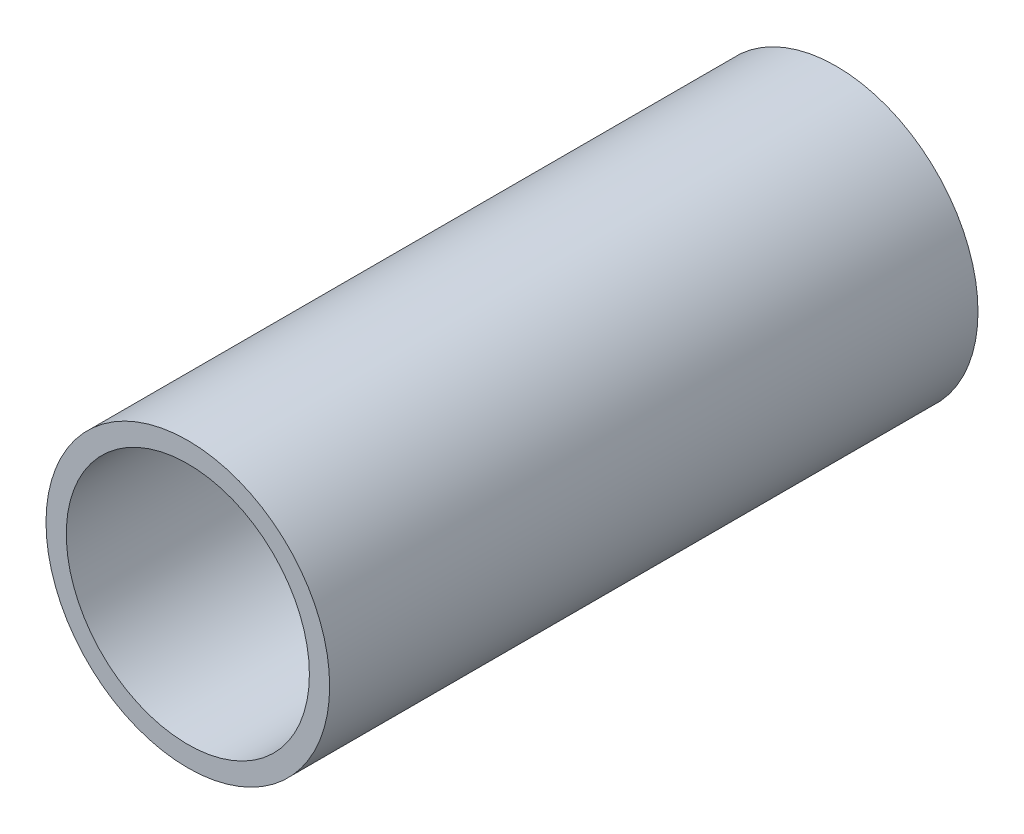
ISO-10303-21;
HEADER;
FILE_DESCRIPTION(('STEP AP214'),'2;1');
FILE_NAME('part.step','',(''),(''),'','','');
FILE_SCHEMA(('AUTOMOTIVE_DESIGN { 1 0 10303 214 1 1 1 1 }'));
ENDSEC;
DATA;
#1=APPLICATION_CONTEXT('core data for automotive mechanical design processes');
#2=APPLICATION_PROTOCOL_DEFINITION('international standard','automotive_design',2000,#1);
#3=PRODUCT_CONTEXT('',#1,'mechanical');
#4=PRODUCT('Part','Part','',(#3));
#5=PRODUCT_RELATED_PRODUCT_CATEGORY('part','',(#4));
#6=PRODUCT_DEFINITION_FORMATION('','',#4);
#7=PRODUCT_DEFINITION_CONTEXT('part definition',#1,'design');
#8=PRODUCT_DEFINITION('design','',#6,#7);
#9=PRODUCT_DEFINITION_SHAPE('','',#8);
#10=(LENGTH_UNIT() NAMED_UNIT(*) SI_UNIT(.MILLI.,.METRE.));
#11=(NAMED_UNIT(*) PLANE_ANGLE_UNIT() SI_UNIT($,.RADIAN.));
#12=(NAMED_UNIT(*) SI_UNIT($,.STERADIAN.) SOLID_ANGLE_UNIT());
#13=UNCERTAINTY_MEASURE_WITH_UNIT(LENGTH_MEASURE(1.E-05),#10,'distance_accuracy_value','');
#14=(GEOMETRIC_REPRESENTATION_CONTEXT(3) GLOBAL_UNCERTAINTY_ASSIGNED_CONTEXT((#13)) GLOBAL_UNIT_ASSIGNED_CONTEXT((#10,
#11,#12)) REPRESENTATION_CONTEXT('',''));
#15=CARTESIAN_POINT('',(0.,0.,0.));
#16=DIRECTION('',(0.,0.,1.));
#17=DIRECTION('',(1.,0.,0.));
#18=AXIS2_PLACEMENT_3D('',#15,#16,#17);
#19=CARTESIAN_POINT('',(0.,0.,101.6));
#20=DIRECTION('',(0.,0.,-1.));
#21=DIRECTION('',(-1.,0.,0.));
#22=AXIS2_PLACEMENT_3D('',#19,#20,#21);
#23=CYLINDRICAL_SURFACE('',#22,38.1);
#24=CARTESIAN_POINT('',(0.,0.,-101.6));
#25=DIRECTION('',(0.,0.,1.));
#26=DIRECTION('',(1.,0.,0.));
#27=AXIS2_PLACEMENT_3D('',#24,#25,#26);
#28=CIRCLE('',#27,38.1);
#29=CARTESIAN_POINT('',(38.1,0.,-101.6));
#30=VERTEX_POINT('',#29);
#31=EDGE_CURVE('E66',#30,#30,#28,.T.);
#32=ORIENTED_EDGE('',*,*,#31,.F.);
#33=EDGE_LOOP('',(#32));
#34=FACE_BOUND('',#33,.T.);
#35=CARTESIAN_POINT('',(0.,0.,-25.4));
#36=DIRECTION('',(0.,0.,1.));
#37=DIRECTION('',(1.,0.,0.));
#38=AXIS2_PLACEMENT_3D('',#35,#36,#37);
#39=CIRCLE('',#38,38.1);
#40=CARTESIAN_POINT('',(38.1,0.,-25.4));
#41=VERTEX_POINT('',#40);
#42=EDGE_CURVE('E101',#41,#41,#39,.T.);
#43=ORIENTED_EDGE('',*,*,#42,.T.);
#44=EDGE_LOOP('',(#43));
#45=FACE_BOUND('',#44,.T.);
#46=ADVANCED_FACE('F43',(#34,#45),#23,.F.);
#47=CARTESIAN_POINT('',(0.,0.,25.4));
#48=DIRECTION('',(0.,0.,1.));
#49=DIRECTION('',(1.,0.,0.));
#50=AXIS2_PLACEMENT_3D('',#47,#48,#49);
#51=CIRCLE('',#50,38.1);
#52=CARTESIAN_POINT('',(38.1,0.,25.4));
#53=VERTEX_POINT('',#52);
#54=EDGE_CURVE('E10',#53,#53,#51,.T.);
#55=ORIENTED_EDGE('',*,*,#54,.F.);
#56=EDGE_LOOP('',(#55));
#57=FACE_BOUND('',#56,.T.);
#58=CARTESIAN_POINT('',(0.,0.,101.6));
#59=DIRECTION('',(0.,0.,1.));
#60=DIRECTION('',(1.,0.,0.));
#61=AXIS2_PLACEMENT_3D('',#58,#59,#60);
#62=CIRCLE('',#61,38.1);
#63=CARTESIAN_POINT('',(38.1,0.,101.6));
#64=VERTEX_POINT('',#63);
#65=EDGE_CURVE('E56',#64,#64,#62,.T.);
#66=ORIENTED_EDGE('',*,*,#65,.T.);
#67=EDGE_LOOP('',(#66));
#68=FACE_BOUND('',#67,.T.);
#69=ADVANCED_FACE('F45',(#57,#68),#23,.F.);
#70=CARTESIAN_POINT('',(0.,0.,101.6));
#71=DIRECTION('',(0.,0.,-1.));
#72=DIRECTION('',(-1.,0.,0.));
#73=AXIS2_PLACEMENT_3D('',#70,#71,#72);
#74=CYLINDRICAL_SURFACE('',#73,44.45);
#75=CARTESIAN_POINT('',(0.,0.,101.6));
#76=DIRECTION('',(0.,0.,1.));
#77=DIRECTION('',(1.,0.,0.));
#78=AXIS2_PLACEMENT_3D('',#75,#76,#77);
#79=CIRCLE('',#78,44.45);
#80=CARTESIAN_POINT('',(44.45,0.,101.6));
#81=VERTEX_POINT('',#80);
#82=EDGE_CURVE('E51',#81,#81,#79,.T.);
#83=ORIENTED_EDGE('',*,*,#82,.F.);
#84=EDGE_LOOP('',(#83));
#85=FACE_BOUND('',#84,.T.);
#86=CARTESIAN_POINT('',(0.,0.,-101.6));
#87=DIRECTION('',(0.,0.,1.));
#88=DIRECTION('',(1.,0.,0.));
#89=AXIS2_PLACEMENT_3D('',#86,#87,#88);
#90=CIRCLE('',#89,44.45);
#91=CARTESIAN_POINT('',(44.45,0.,-101.6));
#92=VERTEX_POINT('',#91);
#93=EDGE_CURVE('E62',#92,#92,#90,.T.);
#94=ORIENTED_EDGE('',*,*,#93,.T.);
#95=EDGE_LOOP('',(#94));
#96=FACE_BOUND('',#95,.T.);
#97=ADVANCED_FACE('F74',(#85,#96),#74,.T.);
#98=CARTESIAN_POINT('',(0.,0.,101.6));
#99=DIRECTION('',(0.,0.,1.));
#100=DIRECTION('',(1.,0.,0.));
#101=AXIS2_PLACEMENT_3D('',#98,#99,#100);
#102=PLANE('',#101);
#103=ORIENTED_EDGE('',*,*,#65,.F.);
#104=EDGE_LOOP('',(#103));
#105=FACE_BOUND('',#104,.T.);
#106=ORIENTED_EDGE('',*,*,#82,.T.);
#107=EDGE_LOOP('',(#106));
#108=FACE_BOUND('',#107,.T.);
#109=ADVANCED_FACE('F79',(#105,#108),#102,.T.);
#110=CARTESIAN_POINT('',(0.,0.,-101.6));
#111=DIRECTION('',(0.,0.,1.));
#112=DIRECTION('',(1.,0.,0.));
#113=AXIS2_PLACEMENT_3D('',#110,#111,#112);
#114=PLANE('',#113);
#115=ORIENTED_EDGE('',*,*,#31,.T.);
#116=EDGE_LOOP('',(#115));
#117=FACE_BOUND('',#116,.T.);
#118=ORIENTED_EDGE('',*,*,#93,.F.);
#119=EDGE_LOOP('',(#118));
#120=FACE_BOUND('',#119,.T.);
#121=ADVANCED_FACE('F76',(#117,#120),#114,.F.);
#122=CARTESIAN_POINT('',(0.,0.,25.4));
#123=DIRECTION('',(0.,0.,-1.));
#124=DIRECTION('',(-1.,0.,0.));
#125=AXIS2_PLACEMENT_3D('',#122,#123,#124);
#126=CYLINDRICAL_SURFACE('',#125,12.7);
#127=CARTESIAN_POINT('',(0.,0.,25.4));
#128=DIRECTION('',(0.,0.,1.));
#129=DIRECTION('',(1.,0.,0.));
#130=AXIS2_PLACEMENT_3D('',#127,#128,#129);
#131=CIRCLE('',#130,12.7);
#132=CARTESIAN_POINT('',(12.7,0.,25.4));
#133=VERTEX_POINT('',#132);
#134=EDGE_CURVE('E69',#133,#133,#131,.T.);
#135=ORIENTED_EDGE('',*,*,#134,.T.);
#136=EDGE_LOOP('',(#135));
#137=FACE_BOUND('',#136,.T.);
#138=CARTESIAN_POINT('',(0.,0.,-25.4));
#139=DIRECTION('',(0.,0.,1.));
#140=DIRECTION('',(1.,0.,0.));
#141=AXIS2_PLACEMENT_3D('',#138,#139,#140);
#142=CIRCLE('',#141,12.7);
#143=CARTESIAN_POINT('',(12.7,0.,-25.4));
#144=VERTEX_POINT('',#143);
#145=EDGE_CURVE('E104',#144,#144,#142,.T.);
#146=ORIENTED_EDGE('',*,*,#145,.F.);
#147=EDGE_LOOP('',(#146));
#148=FACE_BOUND('',#147,.T.);
#149=ADVANCED_FACE('F78',(#137,#148),#126,.F.);
#150=CARTESIAN_POINT('',(0.,0.,25.4));
#151=DIRECTION('',(0.,0.,1.));
#152=DIRECTION('',(1.,0.,0.));
#153=AXIS2_PLACEMENT_3D('',#150,#151,#152);
#154=PLANE('',#153);
#155=ORIENTED_EDGE('',*,*,#134,.F.);
#156=EDGE_LOOP('',(#155));
#157=FACE_BOUND('',#156,.T.);
#158=ORIENTED_EDGE('',*,*,#54,.T.);
#159=EDGE_LOOP('',(#158));
#160=FACE_BOUND('',#159,.T.);
#161=ADVANCED_FACE('F87',(#157,#160),#154,.T.);
#162=CARTESIAN_POINT('',(0.,0.,-25.4));
#163=DIRECTION('',(0.,0.,1.));
#164=DIRECTION('',(1.,0.,0.));
#165=AXIS2_PLACEMENT_3D('',#162,#163,#164);
#166=PLANE('',#165);
#167=ORIENTED_EDGE('',*,*,#145,.T.);
#168=EDGE_LOOP('',(#167));
#169=FACE_BOUND('',#168,.T.);
#170=ORIENTED_EDGE('',*,*,#42,.F.);
#171=EDGE_LOOP('',(#170));
#172=FACE_BOUND('',#171,.T.);
#173=ADVANCED_FACE('F113',(#169,#172),#166,.F.);
#174=CLOSED_SHELL('',(#46,#69,#97,#109,#121,#149,#161,#173));
#175=MANIFOLD_SOLID_BREP('B2',#174);
#176=ADVANCED_BREP_SHAPE_REPRESENTATION('',(#18,#175),#14);
#177=SHAPE_DEFINITION_REPRESENTATION(#9,#176);
ENDSEC;
END-ISO-10303-21;
